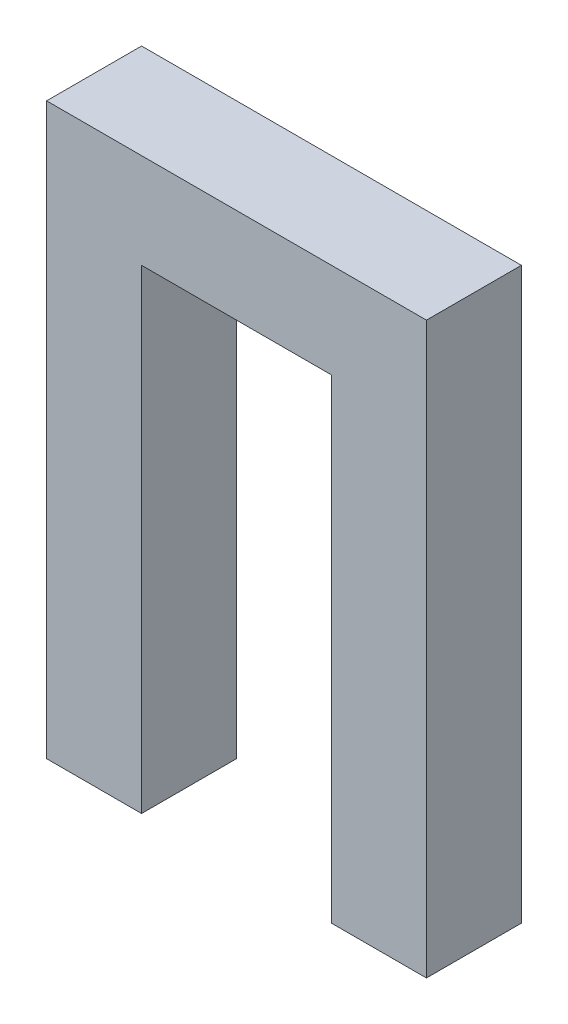
ISO-10303-21;
HEADER;
FILE_DESCRIPTION(('STEP AP214'),'2;1');
FILE_NAME('part.step','',(''),(''),'','','');
FILE_SCHEMA(('AUTOMOTIVE_DESIGN { 1 0 10303 214 1 1 1 1 }'));
ENDSEC;
DATA;
#1=APPLICATION_CONTEXT('core data for automotive mechanical design processes');
#2=APPLICATION_PROTOCOL_DEFINITION('international standard','automotive_design',2000,#1);
#3=PRODUCT_CONTEXT('',#1,'mechanical');
#4=PRODUCT('Part','Part','',(#3));
#5=PRODUCT_RELATED_PRODUCT_CATEGORY('part','',(#4));
#6=PRODUCT_DEFINITION_FORMATION('','',#4);
#7=PRODUCT_DEFINITION_CONTEXT('part definition',#1,'design');
#8=PRODUCT_DEFINITION('design','',#6,#7);
#9=PRODUCT_DEFINITION_SHAPE('','',#8);
#10=(LENGTH_UNIT() NAMED_UNIT(*) SI_UNIT(.MILLI.,.METRE.));
#11=(NAMED_UNIT(*) PLANE_ANGLE_UNIT() SI_UNIT($,.RADIAN.));
#12=(NAMED_UNIT(*) SI_UNIT($,.STERADIAN.) SOLID_ANGLE_UNIT());
#13=UNCERTAINTY_MEASURE_WITH_UNIT(LENGTH_MEASURE(1.E-05),#10,'distance_accuracy_value','');
#14=(GEOMETRIC_REPRESENTATION_CONTEXT(3) GLOBAL_UNCERTAINTY_ASSIGNED_CONTEXT((#13)) GLOBAL_UNIT_ASSIGNED_CONTEXT((#10,
#11,#12)) REPRESENTATION_CONTEXT('',''));
#15=CARTESIAN_POINT('',(0.,0.,0.));
#16=DIRECTION('',(0.,0.,1.));
#17=DIRECTION('',(1.,0.,0.));
#18=AXIS2_PLACEMENT_3D('',#15,#16,#17);
#19=CARTESIAN_POINT('',(-10.,0.,10.));
#20=DIRECTION('',(1.,0.,0.));
#21=DIRECTION('',(0.,1.,0.));
#22=AXIS2_PLACEMENT_3D('',#19,#20,#21);
#23=PLANE('',#22);
#24=DIRECTION('',(0.,-1.,0.));
#25=VECTOR('',#24,1.);
#26=CARTESIAN_POINT('',(-10.,0.,0.));
#27=LINE('',#26,#25);
#28=CARTESIAN_POINT('',(-10.,60.,0.));
#29=VERTEX_POINT('',#28);
#30=CARTESIAN_POINT('',(-10.,0.,0.));
#31=VERTEX_POINT('',#30);
#32=EDGE_CURVE('E129',#29,#31,#27,.T.);
#33=ORIENTED_EDGE('',*,*,#32,.T.);
#34=DIRECTION('',(0.,0.,-1.));
#35=VECTOR('',#34,1.);
#36=CARTESIAN_POINT('',(-10.,0.,10.));
#37=LINE('',#36,#35);
#38=CARTESIAN_POINT('',(-10.,0.,10.));
#39=VERTEX_POINT('',#38);
#40=EDGE_CURVE('E11',#39,#31,#37,.T.);
#41=ORIENTED_EDGE('',*,*,#40,.F.);
#42=DIRECTION('',(0.,-1.,0.));
#43=VECTOR('',#42,1.);
#44=CARTESIAN_POINT('',(-10.,0.,10.));
#45=LINE('',#44,#43);
#46=CARTESIAN_POINT('',(-10.,60.,10.));
#47=VERTEX_POINT('',#46);
#48=EDGE_CURVE('E143',#47,#39,#45,.T.);
#49=ORIENTED_EDGE('',*,*,#48,.F.);
#50=DIRECTION('',(0.,0.,-1.));
#51=VECTOR('',#50,1.);
#52=CARTESIAN_POINT('',(-10.,60.,10.));
#53=LINE('',#52,#51);
#54=EDGE_CURVE('E125',#47,#29,#53,.T.);
#55=ORIENTED_EDGE('',*,*,#54,.T.);
#56=EDGE_LOOP('',(#33,#41,#49,#55));
#57=FACE_BOUND('',#56,.T.);
#58=ADVANCED_FACE('F33',(#57),#23,.F.);
#59=CARTESIAN_POINT('',(0.,0.,10.));
#60=DIRECTION('',(0.,1.,0.));
#61=DIRECTION('',(0.,0.,1.));
#62=AXIS2_PLACEMENT_3D('',#59,#60,#61);
#63=PLANE('',#62);
#64=DIRECTION('',(1.,0.,0.));
#65=VECTOR('',#64,1.);
#66=CARTESIAN_POINT('',(0.,0.,0.));
#67=LINE('',#66,#65);
#68=CARTESIAN_POINT('',(0.,0.,0.));
#69=VERTEX_POINT('',#68);
#70=EDGE_CURVE('E132',#31,#69,#67,.T.);
#71=ORIENTED_EDGE('',*,*,#70,.T.);
#72=DIRECTION('',(0.,0.,-1.));
#73=VECTOR('',#72,1.);
#74=CARTESIAN_POINT('',(0.,0.,10.));
#75=LINE('',#74,#73);
#76=CARTESIAN_POINT('',(0.,0.,10.));
#77=VERTEX_POINT('',#76);
#78=EDGE_CURVE('E41',#77,#69,#75,.T.);
#79=ORIENTED_EDGE('',*,*,#78,.F.);
#80=DIRECTION('',(1.,0.,0.));
#81=VECTOR('',#80,1.);
#82=CARTESIAN_POINT('',(0.,0.,10.));
#83=LINE('',#82,#81);
#84=EDGE_CURVE('E92',#39,#77,#83,.T.);
#85=ORIENTED_EDGE('',*,*,#84,.F.);
#86=ORIENTED_EDGE('',*,*,#40,.T.);
#87=EDGE_LOOP('',(#71,#79,#85,#86));
#88=FACE_BOUND('',#87,.T.);
#89=ADVANCED_FACE('F178',(#88),#63,.F.);
#90=CARTESIAN_POINT('',(0.,0.,10.));
#91=DIRECTION('',(-1.,0.,0.));
#92=DIRECTION('',(0.,-1.,0.));
#93=AXIS2_PLACEMENT_3D('',#90,#91,#92);
#94=PLANE('',#93);
#95=DIRECTION('',(0.,1.,0.));
#96=VECTOR('',#95,1.);
#97=CARTESIAN_POINT('',(0.,0.,0.));
#98=LINE('',#97,#96);
#99=CARTESIAN_POINT('',(0.,50.,0.));
#100=VERTEX_POINT('',#99);
#101=EDGE_CURVE('E134',#69,#100,#98,.T.);
#102=ORIENTED_EDGE('',*,*,#101,.T.);
#103=DIRECTION('',(0.,0.,-1.));
#104=VECTOR('',#103,1.);
#105=CARTESIAN_POINT('',(0.,50.,10.));
#106=LINE('',#105,#104);
#107=CARTESIAN_POINT('',(0.,50.,10.));
#108=VERTEX_POINT('',#107);
#109=EDGE_CURVE('E150',#108,#100,#106,.T.);
#110=ORIENTED_EDGE('',*,*,#109,.F.);
#111=DIRECTION('',(0.,1.,0.));
#112=VECTOR('',#111,1.);
#113=CARTESIAN_POINT('',(0.,0.,10.));
#114=LINE('',#113,#112);
#115=EDGE_CURVE('E158',#77,#108,#114,.T.);
#116=ORIENTED_EDGE('',*,*,#115,.F.);
#117=ORIENTED_EDGE('',*,*,#78,.T.);
#118=EDGE_LOOP('',(#102,#110,#116,#117));
#119=FACE_BOUND('',#118,.T.);
#120=ADVANCED_FACE('F156',(#119),#94,.F.);
#121=CARTESIAN_POINT('',(0.,50.,10.));
#122=DIRECTION('',(0.,1.,0.));
#123=DIRECTION('',(0.,0.,1.));
#124=AXIS2_PLACEMENT_3D('',#121,#122,#123);
#125=PLANE('',#124);
#126=DIRECTION('',(1.,0.,0.));
#127=VECTOR('',#126,1.);
#128=CARTESIAN_POINT('',(0.,50.,0.));
#129=LINE('',#128,#127);
#130=CARTESIAN_POINT('',(20.,50.,0.));
#131=VERTEX_POINT('',#130);
#132=EDGE_CURVE('E136',#100,#131,#129,.T.);
#133=ORIENTED_EDGE('',*,*,#132,.T.);
#134=DIRECTION('',(0.,0.,-1.));
#135=VECTOR('',#134,1.);
#136=CARTESIAN_POINT('',(20.,50.,10.));
#137=LINE('',#136,#135);
#138=CARTESIAN_POINT('',(20.,50.,10.));
#139=VERTEX_POINT('',#138);
#140=EDGE_CURVE('E147',#139,#131,#137,.T.);
#141=ORIENTED_EDGE('',*,*,#140,.F.);
#142=DIRECTION('',(1.,0.,0.));
#143=VECTOR('',#142,1.);
#144=CARTESIAN_POINT('',(0.,50.,10.));
#145=LINE('',#144,#143);
#146=EDGE_CURVE('E170',#108,#139,#145,.T.);
#147=ORIENTED_EDGE('',*,*,#146,.F.);
#148=ORIENTED_EDGE('',*,*,#109,.T.);
#149=EDGE_LOOP('',(#133,#141,#147,#148));
#150=FACE_BOUND('',#149,.T.);
#151=ADVANCED_FACE('F166',(#150),#125,.F.);
#152=CARTESIAN_POINT('',(20.,0.,10.));
#153=DIRECTION('',(1.,0.,0.));
#154=DIRECTION('',(0.,1.,0.));
#155=AXIS2_PLACEMENT_3D('',#152,#153,#154);
#156=PLANE('',#155);
#157=DIRECTION('',(0.,-1.,0.));
#158=VECTOR('',#157,1.);
#159=CARTESIAN_POINT('',(20.,0.,0.));
#160=LINE('',#159,#158);
#161=CARTESIAN_POINT('',(20.,0.,0.));
#162=VERTEX_POINT('',#161);
#163=EDGE_CURVE('E138',#131,#162,#160,.T.);
#164=ORIENTED_EDGE('',*,*,#163,.T.);
#165=DIRECTION('',(0.,0.,-1.));
#166=VECTOR('',#165,1.);
#167=CARTESIAN_POINT('',(20.,0.,10.));
#168=LINE('',#167,#166);
#169=CARTESIAN_POINT('',(20.,0.,10.));
#170=VERTEX_POINT('',#169);
#171=EDGE_CURVE('E120',#170,#162,#168,.T.);
#172=ORIENTED_EDGE('',*,*,#171,.F.);
#173=DIRECTION('',(0.,-1.,0.));
#174=VECTOR('',#173,1.);
#175=CARTESIAN_POINT('',(20.,0.,10.));
#176=LINE('',#175,#174);
#177=EDGE_CURVE('E111',#139,#170,#176,.T.);
#178=ORIENTED_EDGE('',*,*,#177,.F.);
#179=ORIENTED_EDGE('',*,*,#140,.T.);
#180=EDGE_LOOP('',(#164,#172,#178,#179));
#181=FACE_BOUND('',#180,.T.);
#182=ADVANCED_FACE('F169',(#181),#156,.F.);
#183=CARTESIAN_POINT('',(0.,0.,10.));
#184=DIRECTION('',(0.,1.,0.));
#185=DIRECTION('',(0.,0.,1.));
#186=AXIS2_PLACEMENT_3D('',#183,#184,#185);
#187=PLANE('',#186);
#188=DIRECTION('',(1.,0.,0.));
#189=VECTOR('',#188,1.);
#190=CARTESIAN_POINT('',(0.,0.,0.));
#191=LINE('',#190,#189);
#192=CARTESIAN_POINT('',(30.,0.,0.));
#193=VERTEX_POINT('',#192);
#194=EDGE_CURVE('E119',#162,#193,#191,.T.);
#195=ORIENTED_EDGE('',*,*,#194,.T.);
#196=DIRECTION('',(0.,0.,-1.));
#197=VECTOR('',#196,1.);
#198=CARTESIAN_POINT('',(30.,0.,10.));
#199=LINE('',#198,#197);
#200=CARTESIAN_POINT('',(30.,0.,10.));
#201=VERTEX_POINT('',#200);
#202=EDGE_CURVE('E116',#201,#193,#199,.T.);
#203=ORIENTED_EDGE('',*,*,#202,.F.);
#204=DIRECTION('',(1.,0.,0.));
#205=VECTOR('',#204,1.);
#206=CARTESIAN_POINT('',(0.,0.,10.));
#207=LINE('',#206,#205);
#208=EDGE_CURVE('E105',#170,#201,#207,.T.);
#209=ORIENTED_EDGE('',*,*,#208,.F.);
#210=ORIENTED_EDGE('',*,*,#171,.T.);
#211=EDGE_LOOP('',(#195,#203,#209,#210));
#212=FACE_BOUND('',#211,.T.);
#213=ADVANCED_FACE('F117',(#212),#187,.F.);
#214=CARTESIAN_POINT('',(30.,0.,10.));
#215=DIRECTION('',(-1.,0.,0.));
#216=DIRECTION('',(0.,-1.,0.));
#217=AXIS2_PLACEMENT_3D('',#214,#215,#216);
#218=PLANE('',#217);
#219=DIRECTION('',(0.,1.,0.));
#220=VECTOR('',#219,1.);
#221=CARTESIAN_POINT('',(30.,0.,0.));
#222=LINE('',#221,#220);
#223=CARTESIAN_POINT('',(30.,60.,0.));
#224=VERTEX_POINT('',#223);
#225=EDGE_CURVE('E78',#193,#224,#222,.T.);
#226=ORIENTED_EDGE('',*,*,#225,.T.);
#227=DIRECTION('',(0.,0.,-1.));
#228=VECTOR('',#227,1.);
#229=CARTESIAN_POINT('',(30.,60.,10.));
#230=LINE('',#229,#228);
#231=CARTESIAN_POINT('',(30.,60.,10.));
#232=VERTEX_POINT('',#231);
#233=EDGE_CURVE('E121',#232,#224,#230,.T.);
#234=ORIENTED_EDGE('',*,*,#233,.F.);
#235=DIRECTION('',(0.,1.,0.));
#236=VECTOR('',#235,1.);
#237=CARTESIAN_POINT('',(30.,0.,10.));
#238=LINE('',#237,#236);
#239=EDGE_CURVE('E109',#201,#232,#238,.T.);
#240=ORIENTED_EDGE('',*,*,#239,.F.);
#241=ORIENTED_EDGE('',*,*,#202,.T.);
#242=EDGE_LOOP('',(#226,#234,#240,#241));
#243=FACE_BOUND('',#242,.T.);
#244=ADVANCED_FACE('F123',(#243),#218,.F.);
#245=CARTESIAN_POINT('',(0.,60.,10.));
#246=DIRECTION('',(0.,-1.,0.));
#247=DIRECTION('',(0.,0.,-1.));
#248=AXIS2_PLACEMENT_3D('',#245,#246,#247);
#249=PLANE('',#248);
#250=DIRECTION('',(-1.,0.,0.));
#251=VECTOR('',#250,1.);
#252=CARTESIAN_POINT('',(0.,60.,0.));
#253=LINE('',#252,#251);
#254=EDGE_CURVE('E84',#224,#29,#253,.T.);
#255=ORIENTED_EDGE('',*,*,#254,.T.);
#256=ORIENTED_EDGE('',*,*,#54,.F.);
#257=DIRECTION('',(-1.,0.,0.));
#258=VECTOR('',#257,1.);
#259=CARTESIAN_POINT('',(0.,60.,10.));
#260=LINE('',#259,#258);
#261=EDGE_CURVE('E49',#232,#47,#260,.T.);
#262=ORIENTED_EDGE('',*,*,#261,.F.);
#263=ORIENTED_EDGE('',*,*,#233,.T.);
#264=EDGE_LOOP('',(#255,#256,#262,#263));
#265=FACE_BOUND('',#264,.T.);
#266=ADVANCED_FACE('F194',(#265),#249,.F.);
#267=CARTESIAN_POINT('',(0.,0.,10.));
#268=DIRECTION('',(0.,0.,1.));
#269=DIRECTION('',(1.,0.,0.));
#270=AXIS2_PLACEMENT_3D('',#267,#268,#269);
#271=PLANE('',#270);
#272=ORIENTED_EDGE('',*,*,#48,.T.);
#273=ORIENTED_EDGE('',*,*,#84,.T.);
#274=ORIENTED_EDGE('',*,*,#115,.T.);
#275=ORIENTED_EDGE('',*,*,#146,.T.);
#276=ORIENTED_EDGE('',*,*,#177,.T.);
#277=ORIENTED_EDGE('',*,*,#208,.T.);
#278=ORIENTED_EDGE('',*,*,#239,.T.);
#279=ORIENTED_EDGE('',*,*,#261,.T.);
#280=EDGE_LOOP('',(#272,#273,#274,#275,#276,#277,#278,#279));
#281=FACE_BOUND('',#280,.T.);
#282=ADVANCED_FACE('F107',(#281),#271,.T.);
#283=CARTESIAN_POINT('',(0.,0.,0.));
#284=DIRECTION('',(0.,0.,1.));
#285=DIRECTION('',(1.,0.,0.));
#286=AXIS2_PLACEMENT_3D('',#283,#284,#285);
#287=PLANE('',#286);
#288=ORIENTED_EDGE('',*,*,#32,.F.);
#289=ORIENTED_EDGE('',*,*,#254,.F.);
#290=ORIENTED_EDGE('',*,*,#225,.F.);
#291=ORIENTED_EDGE('',*,*,#194,.F.);
#292=ORIENTED_EDGE('',*,*,#163,.F.);
#293=ORIENTED_EDGE('',*,*,#132,.F.);
#294=ORIENTED_EDGE('',*,*,#101,.F.);
#295=ORIENTED_EDGE('',*,*,#70,.F.);
#296=EDGE_LOOP('',(#288,#289,#290,#291,#292,#293,#294,#295));
#297=FACE_BOUND('',#296,.T.);
#298=ADVANCED_FACE('F162',(#297),#287,.F.);
#299=CLOSED_SHELL('',(#58,#89,#120,#151,#182,#213,#244,#266,#282,#298));
#300=MANIFOLD_SOLID_BREP('B2',#299);
#301=ADVANCED_BREP_SHAPE_REPRESENTATION('',(#18,#300),#14);
#302=SHAPE_DEFINITION_REPRESENTATION(#9,#301);
ENDSEC;
END-ISO-10303-21;
